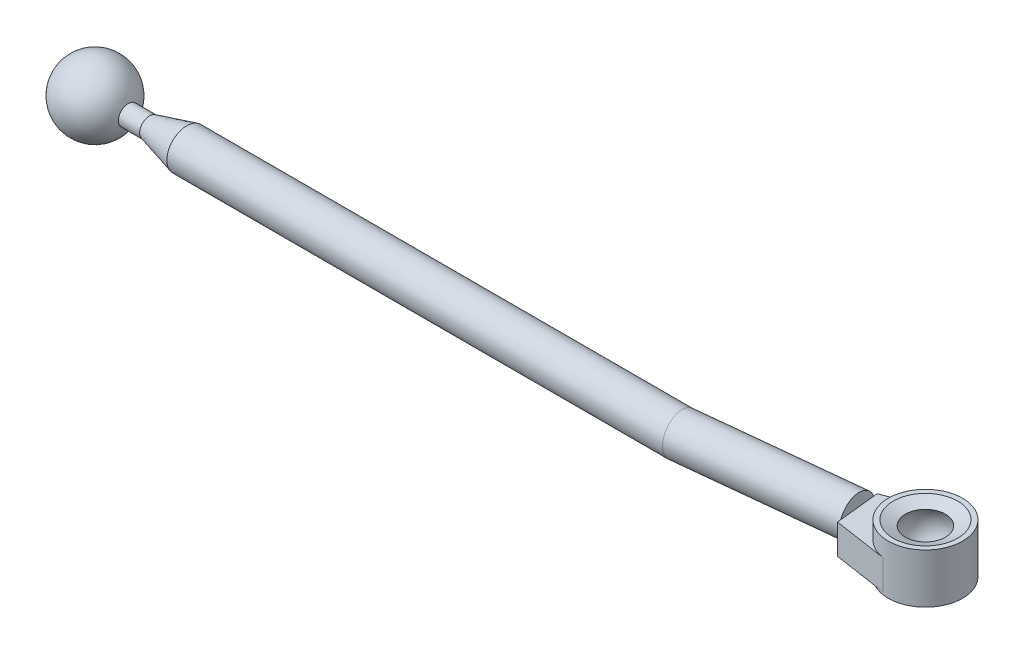
ISO-10303-21;
HEADER;
FILE_DESCRIPTION(('STEP AP214'),'2;1');
FILE_NAME('part.step','',(''),(''),'','','');
FILE_SCHEMA(('AUTOMOTIVE_DESIGN { 1 0 10303 214 1 1 1 1 }'));
ENDSEC;
DATA;
#1=APPLICATION_CONTEXT('core data for automotive mechanical design processes');
#2=APPLICATION_PROTOCOL_DEFINITION('international standard','automotive_design',2000,#1);
#3=PRODUCT_CONTEXT('',#1,'mechanical');
#4=PRODUCT('Part','Part','',(#3));
#5=PRODUCT_RELATED_PRODUCT_CATEGORY('part','',(#4));
#6=PRODUCT_DEFINITION_FORMATION('','',#4);
#7=PRODUCT_DEFINITION_CONTEXT('part definition',#1,'design');
#8=PRODUCT_DEFINITION('design','',#6,#7);
#9=PRODUCT_DEFINITION_SHAPE('','',#8);
#10=(LENGTH_UNIT() NAMED_UNIT(*) SI_UNIT(.MILLI.,.METRE.));
#11=(NAMED_UNIT(*) PLANE_ANGLE_UNIT() SI_UNIT($,.RADIAN.));
#12=(NAMED_UNIT(*) SI_UNIT($,.STERADIAN.) SOLID_ANGLE_UNIT());
#13=UNCERTAINTY_MEASURE_WITH_UNIT(LENGTH_MEASURE(1.E-05),#10,'distance_accuracy_value','');
#14=(GEOMETRIC_REPRESENTATION_CONTEXT(3) GLOBAL_UNCERTAINTY_ASSIGNED_CONTEXT((#13)) GLOBAL_UNIT_ASSIGNED_CONTEXT((#10,
#11,#12)) REPRESENTATION_CONTEXT('',''));
#15=CARTESIAN_POINT('',(0.,0.,0.));
#16=DIRECTION('',(0.,0.,1.));
#17=DIRECTION('',(1.,0.,0.));
#18=AXIS2_PLACEMENT_3D('',#15,#16,#17);
#19=CARTESIAN_POINT('',(237.,0.,0.));
#20=DIRECTION('',(0.,0.,1.));
#21=DIRECTION('',(0.,1.,0.));
#22=AXIS2_PLACEMENT_3D('',#19,#20,#21);
#23=SPHERICAL_SURFACE('',#22,14.);
#24=CARTESIAN_POINT('',(237.,0.,0.));
#25=DIRECTION('',(-1.,0.,0.));
#26=DIRECTION('',(0.,0.,1.));
#27=AXIS2_PLACEMENT_3D('',#24,#25,#26);
#28=SPHERICAL_SURFACE('',#27,14.);
#29=CARTESIAN_POINT('',(250.416407864999,0.,0.));
#30=DIRECTION('',(-0.999999999999999,0.,0.));
#31=DIRECTION('',(0.,0.,1.));
#32=AXIS2_PLACEMENT_3D('',#29,#30,#31);
#33=CIRCLE('',#32,4.);
#34=CARTESIAN_POINT('',(250.416407864999,0.,4.));
#35=VERTEX_POINT('',#34);
#36=EDGE_CURVE('E161',#35,#35,#33,.F.);
#37=ORIENTED_EDGE('',*,*,#36,.F.);
#38=EDGE_LOOP('',(#37));
#39=FACE_BOUND('',#38,.T.);
#40=ADVANCED_FACE('F43',(#39),#28,.T.);
#41=CARTESIAN_POINT('',(259.,0.,0.));
#42=DIRECTION('',(-1.,0.,0.));
#43=DIRECTION('',(0.,0.,1.));
#44=AXIS2_PLACEMENT_3D('',#41,#42,#43);
#45=CYLINDRICAL_SURFACE('',#44,4.);
#46=CARTESIAN_POINT('',(259.,0.,0.));
#47=DIRECTION('',(1.,0.,0.));
#48=DIRECTION('',(0.,0.,-1.));
#49=AXIS2_PLACEMENT_3D('',#46,#47,#48);
#50=CIRCLE('',#49,4.);
#51=CARTESIAN_POINT('',(259.,0.,-4.));
#52=VERTEX_POINT('',#51);
#53=EDGE_CURVE('E163',#52,#52,#50,.T.);
#54=ORIENTED_EDGE('',*,*,#53,.F.);
#55=EDGE_LOOP('',(#54));
#56=FACE_BOUND('',#55,.T.);
#57=ORIENTED_EDGE('',*,*,#36,.T.);
#58=EDGE_LOOP('',(#57));
#59=FACE_BOUND('',#58,.T.);
#60=ADVANCED_FACE('F150',(#56,#59),#45,.T.);
#61=CARTESIAN_POINT('',(259.,0.,0.));
#62=DIRECTION('',(1.,0.,0.));
#63=DIRECTION('',(0.,0.,-1.));
#64=AXIS2_PLACEMENT_3D('',#61,#62,#63);
#65=CONICAL_SURFACE('',#64,4.,0.261799387799149);
#66=CARTESIAN_POINT('',(274.,0.,0.));
#67=DIRECTION('',(1.,0.,0.));
#68=DIRECTION('',(0.,0.,-1.));
#69=AXIS2_PLACEMENT_3D('',#66,#67,#68);
#70=CIRCLE('',#69,8.01923788646685);
#71=CARTESIAN_POINT('',(274.,0.,-8.01923788646685));
#72=VERTEX_POINT('',#71);
#73=EDGE_CURVE('E132',#72,#72,#70,.T.);
#74=ORIENTED_EDGE('',*,*,#73,.F.);
#75=EDGE_LOOP('',(#74));
#76=FACE_BOUND('',#75,.T.);
#77=ORIENTED_EDGE('',*,*,#53,.T.);
#78=EDGE_LOOP('',(#77));
#79=FACE_BOUND('',#78,.T.);
#80=ADVANCED_FACE('F146',(#76,#79),#65,.T.);
#81=CARTESIAN_POINT('',(474.,0.,0.));
#82=DIRECTION('',(-1.,0.,0.));
#83=DIRECTION('',(0.,0.,1.));
#84=AXIS2_PLACEMENT_3D('',#81,#82,#83);
#85=CYLINDRICAL_SURFACE('',#84,8.01923788646685);
#86=CARTESIAN_POINT('',(473.15714413453,0.,0.));
#87=DIRECTION('',(0.994521895368274,0.,-0.104528463267644));
#88=DIRECTION('',(-0.104528463267644,0.,-0.994521895368274));
#89=AXIS2_PLACEMENT_3D('',#86,#87,#88);
#90=ELLIPSE('',#89,8.06341009063184,8.01923788646685);
#91=CARTESIAN_POINT('',(472.314288269059,0.,-8.01923788646685));
#92=VERTEX_POINT('',#91);
#93=EDGE_CURVE('E129',#92,#92,#90,.T.);
#94=ORIENTED_EDGE('',*,*,#93,.F.);
#95=EDGE_LOOP('',(#94));
#96=FACE_BOUND('',#95,.T.);
#97=ORIENTED_EDGE('',*,*,#73,.T.);
#98=EDGE_LOOP('',(#97));
#99=FACE_BOUND('',#98,.T.);
#100=ADVANCED_FACE('F141',(#96,#99),#85,.T.);
#101=CARTESIAN_POINT('',(537.801067333467,0.,-6.79435011239686));
#102=DIRECTION('',(0.994521895368274,0.,-0.104528463267644));
#103=DIRECTION('',(-0.104528463267644,0.,-0.994521895368274));
#104=AXIS2_PLACEMENT_3D('',#101,#102,#103);
#105=ELLIPSE('',#104,8.06341009063184,8.01923788646685);
#106=DIRECTION('',(-0.994521895368274,0.,0.104528463267644));
#107=VECTOR('',#106,1.);
#108=SURFACE_OF_LINEAR_EXTRUSION('',#105,#107);
#109=CARTESIAN_POINT('',(537.019412737421,3.,-14.231296816505));
#110=VERTEX_POINT('',#109);
#111=CARTESIAN_POINT('',(538.582721929514,3.,0.642596591711303));
#112=VERTEX_POINT('',#111);
#113=EDGE_CURVE('E61',#110,#112,#105,.T.);
#114=ORIENTED_EDGE('',*,*,#113,.F.);
#115=EDGE_CURVE('E133',#112,#110,#105,.T.);
#116=ORIENTED_EDGE('',*,*,#115,.F.);
#117=EDGE_LOOP('',(#114,#116));
#118=FACE_BOUND('',#117,.T.);
#119=ORIENTED_EDGE('',*,*,#93,.T.);
#120=EDGE_LOOP('',(#119));
#121=FACE_BOUND('',#120,.T.);
#122=ADVANCED_FACE('F136',(#118,#121),#108,.F.);
#123=CARTESIAN_POINT('',(537.801067333467,0.,-6.79435011239686));
#124=DIRECTION('',(0.994521895368274,0.,-0.104528463267644));
#125=DIRECTION('',(-0.104528463267644,0.,-0.994521895368274));
#126=AXIS2_PLACEMENT_3D('',#123,#124,#125);
#127=PLANE('',#126);
#128=DIRECTION('',(0.104528463267639,0.,0.994521895368275));
#129=VECTOR('',#128,1.);
#130=CARTESIAN_POINT('',(538.741823502876,3.,2.15634694591763));
#131=LINE('',#130,#129);
#132=EDGE_CURVE('E58',#110,#112,#131,.T.);
#133=ORIENTED_EDGE('',*,*,#132,.F.);
#134=ORIENTED_EDGE('',*,*,#113,.T.);
#135=EDGE_LOOP('',(#133,#134));
#136=FACE_BOUND('',#135,.T.);
#137=ADVANCED_FACE('F140',(#136),#127,.T.);
#138=CARTESIAN_POINT('',(538.741823502876,3.,2.15634694591763));
#139=DIRECTION('',(0.994521895368275,0.,-0.104528463267639));
#140=DIRECTION('',(-0.104528463267639,0.,-0.994521895368275));
#141=AXIS2_PLACEMENT_3D('',#138,#139,#140);
#142=PLANE('',#141);
#143=CARTESIAN_POINT('',(538.741823502876,3.,2.15634694591763));
#144=VERTEX_POINT('',#143);
#145=EDGE_CURVE('E118',#112,#144,#131,.T.);
#146=ORIENTED_EDGE('',*,*,#145,.F.);
#147=ORIENTED_EDGE('',*,*,#115,.T.);
#148=CARTESIAN_POINT('',(536.860311164059,3.,-15.7450471707113));
#149=VERTEX_POINT('',#148);
#150=EDGE_CURVE('E166',#149,#110,#131,.T.);
#151=ORIENTED_EDGE('',*,*,#150,.F.);
#152=DIRECTION('',(0.,-1.,0.));
#153=VECTOR('',#152,1.);
#154=CARTESIAN_POINT('',(536.860311164059,3.,-15.7450471707113));
#155=LINE('',#154,#153);
#156=CARTESIAN_POINT('',(536.860311164059,-9.,-15.7450471707113));
#157=VERTEX_POINT('',#156);
#158=EDGE_CURVE('E127',#149,#157,#155,.T.);
#159=ORIENTED_EDGE('',*,*,#158,.T.);
#160=DIRECTION('',(0.104528463267639,0.,0.994521895368275));
#161=VECTOR('',#160,1.);
#162=CARTESIAN_POINT('',(538.741823502876,-9.,2.15634694591763));
#163=LINE('',#162,#161);
#164=CARTESIAN_POINT('',(538.741823502876,-9.,2.15634694591763));
#165=VERTEX_POINT('',#164);
#166=EDGE_CURVE('E96',#157,#165,#163,.T.);
#167=ORIENTED_EDGE('',*,*,#166,.T.);
#168=DIRECTION('',(0.,-1.,0.));
#169=VECTOR('',#168,1.);
#170=CARTESIAN_POINT('',(538.741823502876,3.,2.15634694591763));
#171=LINE('',#170,#169);
#172=EDGE_CURVE('E124',#144,#165,#171,.T.);
#173=ORIENTED_EDGE('',*,*,#172,.F.);
#174=EDGE_LOOP('',(#146,#147,#151,#159,#167,#173));
#175=FACE_BOUND('',#174,.T.);
#176=ADVANCED_FACE('F201',(#175),#142,.F.);
#177=CARTESIAN_POINT('',(536.860311164059,3.,-15.7450471707113));
#178=DIRECTION('',(0.351367061986771,0.,0.936237783765847));
#179=DIRECTION('',(0.936237783765847,0.,-0.351367061986771));
#180=AXIS2_PLACEMENT_3D('',#177,#178,#179);
#181=PLANE('',#180);
#182=DIRECTION('',(-0.936237783765847,0.,0.351367061986771));
#183=VECTOR('',#182,1.);
#184=CARTESIAN_POINT('',(536.860311164059,-9.,-15.7450471707113));
#185=LINE('',#184,#183);
#186=CARTESIAN_POINT('',(557.393608787873,-9.,-23.4511284505755));
#187=VERTEX_POINT('',#186);
#188=EDGE_CURVE('E89',#187,#157,#185,.T.);
#189=ORIENTED_EDGE('',*,*,#188,.T.);
#190=ORIENTED_EDGE('',*,*,#158,.F.);
#191=DIRECTION('',(-0.936237783765847,0.,0.351367061986771));
#192=VECTOR('',#191,1.);
#193=CARTESIAN_POINT('',(536.860311164059,3.,-15.7450471707113));
#194=LINE('',#193,#192);
#195=CARTESIAN_POINT('',(557.393608787873,3.,-23.4511284505755));
#196=VERTEX_POINT('',#195);
#197=EDGE_CURVE('E107',#196,#149,#194,.T.);
#198=ORIENTED_EDGE('',*,*,#197,.F.);
#199=DIRECTION('',(0.,-1.,0.));
#200=VECTOR('',#199,1.);
#201=CARTESIAN_POINT('',(557.393608787873,3.,-23.4511284505755));
#202=LINE('',#201,#200);
#203=EDGE_CURVE('E104',#196,#187,#202,.T.);
#204=ORIENTED_EDGE('',*,*,#203,.T.);
#205=EDGE_LOOP('',(#189,#190,#198,#204));
#206=FACE_BOUND('',#205,.T.);
#207=ADVANCED_FACE('F105',(#206),#181,.F.);
#208=CARTESIAN_POINT('',(538.741823502876,3.,2.15634694591763));
#209=DIRECTION('',(0.149034068029049,0.,-0.988832061862232));
#210=DIRECTION('',(-0.988832061862232,0.,-0.149034068029049));
#211=AXIS2_PLACEMENT_3D('',#208,#209,#210);
#212=PLANE('',#211);
#213=DIRECTION('',(0.988832061862232,0.,0.149034068029049));
#214=VECTOR('',#213,1.);
#215=CARTESIAN_POINT('',(538.741823502876,-9.,2.15634694591763));
#216=LINE('',#215,#214);
#217=CARTESIAN_POINT('',(560.428603697239,-9.,5.42491923384569));
#218=VERTEX_POINT('',#217);
#219=EDGE_CURVE('E116',#165,#218,#216,.T.);
#220=ORIENTED_EDGE('',*,*,#219,.T.);
#221=DIRECTION('',(0.,-1.,0.));
#222=VECTOR('',#221,1.);
#223=CARTESIAN_POINT('',(560.428603697239,3.,5.42491923384569));
#224=LINE('',#223,#222);
#225=CARTESIAN_POINT('',(560.428603697239,3.,5.42491923384569));
#226=VERTEX_POINT('',#225);
#227=EDGE_CURVE('E110',#226,#218,#224,.T.);
#228=ORIENTED_EDGE('',*,*,#227,.F.);
#229=DIRECTION('',(0.988832061862232,0.,0.149034068029049));
#230=VECTOR('',#229,1.);
#231=CARTESIAN_POINT('',(538.741823502876,3.,2.15634694591763));
#232=LINE('',#231,#230);
#233=EDGE_CURVE('E196',#144,#226,#232,.T.);
#234=ORIENTED_EDGE('',*,*,#233,.F.);
#235=ORIENTED_EDGE('',*,*,#172,.T.);
#236=EDGE_LOOP('',(#220,#228,#234,#235));
#237=FACE_BOUND('',#236,.T.);
#238=ADVANCED_FACE('F204',(#237),#212,.F.);
#239=CARTESIAN_POINT('',(562.664114717674,3.,-9.40756169408781));
#240=DIRECTION('',(0.,1.,0.));
#241=DIRECTION('',(0.,0.,1.));
#242=AXIS2_PLACEMENT_3D('',#239,#240,#241);
#243=PLANE('',#242);
#244=ORIENTED_EDGE('',*,*,#197,.T.);
#245=ORIENTED_EDGE('',*,*,#150,.T.);
#246=ORIENTED_EDGE('',*,*,#132,.T.);
#247=ORIENTED_EDGE('',*,*,#145,.T.);
#248=ORIENTED_EDGE('',*,*,#233,.T.);
#249=CARTESIAN_POINT('',(562.664114717674,3.,-9.40756169408781));
#250=DIRECTION('',(0.,-1.,0.));
#251=DIRECTION('',(0.,0.,1.));
#252=AXIS2_PLACEMENT_3D('',#249,#250,#251);
#253=CIRCLE('',#252,15.);
#254=EDGE_CURVE('E111',#226,#196,#253,.T.);
#255=ORIENTED_EDGE('',*,*,#254,.T.);
#256=EDGE_LOOP('',(#244,#245,#246,#247,#248,#255));
#257=FACE_BOUND('',#256,.T.);
#258=ADVANCED_FACE('F206',(#257),#243,.T.);
#259=CARTESIAN_POINT('',(562.664114717674,-9.,-9.40756169408781));
#260=DIRECTION('',(0.,1.,0.));
#261=DIRECTION('',(0.,0.,1.));
#262=AXIS2_PLACEMENT_3D('',#259,#260,#261);
#263=PLANE('',#262);
#264=ORIENTED_EDGE('',*,*,#188,.F.);
#265=CARTESIAN_POINT('',(562.664114717674,-9.,-9.40756169408781));
#266=DIRECTION('',(0.,-1.,0.));
#267=DIRECTION('',(0.,0.,1.));
#268=AXIS2_PLACEMENT_3D('',#265,#266,#267);
#269=CIRCLE('',#268,15.);
#270=EDGE_CURVE('E94',#218,#187,#269,.T.);
#271=ORIENTED_EDGE('',*,*,#270,.F.);
#272=ORIENTED_EDGE('',*,*,#219,.F.);
#273=ORIENTED_EDGE('',*,*,#166,.F.);
#274=EDGE_LOOP('',(#264,#271,#272,#273));
#275=FACE_BOUND('',#274,.T.);
#276=ADVANCED_FACE('F91',(#275),#263,.F.);
#277=CARTESIAN_POINT('',(562.664114717674,10.,-9.40756169408781));
#278=DIRECTION('',(0.,-1.,0.));
#279=DIRECTION('',(0.,0.,-1.));
#280=AXIS2_PLACEMENT_3D('',#277,#278,#279);
#281=CYLINDRICAL_SURFACE('',#280,15.);
#282=ORIENTED_EDGE('',*,*,#254,.F.);
#283=ORIENTED_EDGE('',*,*,#227,.T.);
#284=ORIENTED_EDGE('',*,*,#270,.T.);
#285=ORIENTED_EDGE('',*,*,#203,.F.);
#286=EDGE_LOOP('',(#282,#283,#284,#285));
#287=FACE_BOUND('',#286,.T.);
#288=CARTESIAN_POINT('',(562.664114717674,10.,-9.40756169408781));
#289=DIRECTION('',(0.,1.,0.));
#290=DIRECTION('',(0.,0.,1.));
#291=AXIS2_PLACEMENT_3D('',#288,#289,#290);
#292=CIRCLE('',#291,15.);
#293=CARTESIAN_POINT('',(562.664114717674,10.,5.59243830591222));
#294=VERTEX_POINT('',#293);
#295=EDGE_CURVE('E100',#294,#294,#292,.T.);
#296=ORIENTED_EDGE('',*,*,#295,.F.);
#297=EDGE_LOOP('',(#296));
#298=FACE_BOUND('',#297,.T.);
#299=CARTESIAN_POINT('',(562.664114717674,-10.,-9.40756169408781));
#300=DIRECTION('',(0.,1.,0.));
#301=DIRECTION('',(0.,0.,1.));
#302=AXIS2_PLACEMENT_3D('',#299,#300,#301);
#303=CIRCLE('',#302,15.);
#304=CARTESIAN_POINT('',(562.664114717674,-10.,5.59243830591222));
#305=VERTEX_POINT('',#304);
#306=EDGE_CURVE('E190',#305,#305,#303,.T.);
#307=ORIENTED_EDGE('',*,*,#306,.T.);
#308=EDGE_LOOP('',(#307));
#309=FACE_BOUND('',#308,.T.);
#310=ADVANCED_FACE('F113',(#287,#298,#309),#281,.T.);
#311=CARTESIAN_POINT('',(562.664114717674,10.,-9.40756169408781));
#312=DIRECTION('',(0.,1.,0.));
#313=DIRECTION('',(0.,0.,1.));
#314=AXIS2_PLACEMENT_3D('',#311,#312,#313);
#315=PLANE('',#314);
#316=CARTESIAN_POINT('',(562.664114717674,10.,-9.40756169408781));
#317=DIRECTION('',(0.,1.,0.));
#318=DIRECTION('',(0.,0.,1.));
#319=AXIS2_PLACEMENT_3D('',#316,#317,#318);
#320=CIRCLE('',#319,13.);
#321=CARTESIAN_POINT('',(562.664114717674,10.,3.59243830591219));
#322=VERTEX_POINT('',#321);
#323=EDGE_CURVE('E11',#322,#322,#320,.F.);
#324=ORIENTED_EDGE('',*,*,#323,.T.);
#325=EDGE_LOOP('',(#324));
#326=FACE_BOUND('',#325,.T.);
#327=ORIENTED_EDGE('',*,*,#295,.T.);
#328=EDGE_LOOP('',(#327));
#329=FACE_BOUND('',#328,.T.);
#330=ADVANCED_FACE('F184',(#326,#329),#315,.T.);
#331=CARTESIAN_POINT('',(562.664114717674,-10.,-9.40756169408781));
#332=DIRECTION('',(0.,1.,0.));
#333=DIRECTION('',(0.,0.,1.));
#334=AXIS2_PLACEMENT_3D('',#331,#332,#333);
#335=PLANE('',#334);
#336=ORIENTED_EDGE('',*,*,#306,.F.);
#337=EDGE_LOOP('',(#336));
#338=FACE_BOUND('',#337,.T.);
#339=ADVANCED_FACE('F180',(#338),#335,.F.);
#340=CARTESIAN_POINT('',(562.664114717674,2.,-9.40756169408781));
#341=DIRECTION('',(1.,0.,0.));
#342=DIRECTION('',(0.,0.,-1.));
#343=AXIS2_PLACEMENT_3D('',#340,#341,#342);
#344=SPHERICAL_SURFACE('',#343,10.);
#345=CARTESIAN_POINT('',(562.664114717674,2.,-9.40756169408781));
#346=DIRECTION('',(0.,-1.,0.));
#347=DIRECTION('',(0.,0.,-1.));
#348=AXIS2_PLACEMENT_3D('',#345,#346,#347);
#349=SPHERICAL_SURFACE('',#348,10.);
#350=CARTESIAN_POINT('',(562.664114717674,7.90690661320976,-9.40756169408781));
#351=DIRECTION('',(0.,-1.,0.));
#352=DIRECTION('',(0.,0.,-1.));
#353=AXIS2_PLACEMENT_3D('',#350,#351,#352);
#354=CIRCLE('',#353,8.06898099284036);
#355=CARTESIAN_POINT('',(562.664114717674,7.90690661320976,-17.4765426869282));
#356=VERTEX_POINT('',#355);
#357=EDGE_CURVE('E52',#356,#356,#354,.F.);
#358=ORIENTED_EDGE('',*,*,#357,.T.);
#359=EDGE_LOOP('',(#358));
#360=FACE_BOUND('',#359,.T.);
#361=ADVANCED_FACE('F172',(#360),#349,.F.);
#362=CARTESIAN_POINT('',(562.664114717674,7.90690661320976,-9.40756169408781));
#363=DIRECTION('',(0.,1.,0.));
#364=DIRECTION('',(0.,0.,1.));
#365=AXIS2_PLACEMENT_3D('',#362,#363,#364);
#366=CONICAL_SURFACE('',#365,8.06898099284036,1.16937059883619);
#367=ORIENTED_EDGE('',*,*,#323,.F.);
#368=EDGE_LOOP('',(#367));
#369=FACE_BOUND('',#368,.T.);
#370=ORIENTED_EDGE('',*,*,#357,.F.);
#371=EDGE_LOOP('',(#370));
#372=FACE_BOUND('',#371,.T.);
#373=ADVANCED_FACE('F46',(#369,#372),#366,.F.);
#374=CLOSED_SHELL('',(#40,#60,#80,#100,#122,#137,#176,#207,#238,#258,#276,#310,#330,#339,#361,#373));
#375=MANIFOLD_SOLID_BREP('B2',#374);
#376=ADVANCED_BREP_SHAPE_REPRESENTATION('',(#18,#375),#14);
#377=SHAPE_DEFINITION_REPRESENTATION(#9,#376);
ENDSEC;
END-ISO-10303-21;
